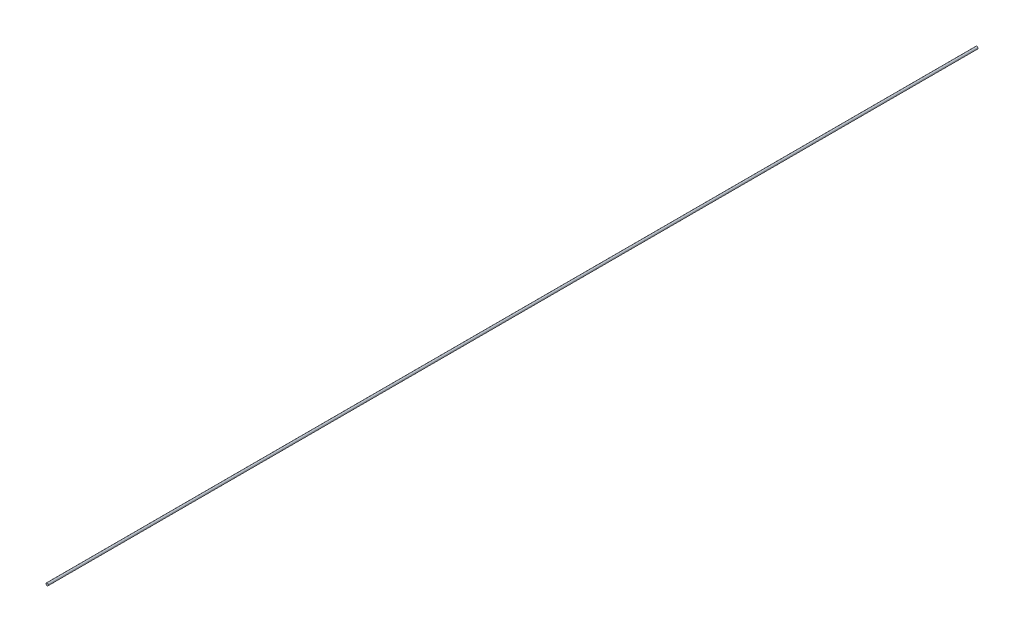
ISO-10303-21;
HEADER;
FILE_DESCRIPTION(('STEP AP214'),'2;1');
FILE_NAME('part.step','',(''),(''),'','','');
FILE_SCHEMA(('AUTOMOTIVE_DESIGN { 1 0 10303 214 1 1 1 1 }'));
ENDSEC;
DATA;
#1=APPLICATION_CONTEXT('core data for automotive mechanical design processes');
#2=APPLICATION_PROTOCOL_DEFINITION('international standard','automotive_design',2000,#1);
#3=PRODUCT_CONTEXT('',#1,'mechanical');
#4=PRODUCT('Part','Part','',(#3));
#5=PRODUCT_RELATED_PRODUCT_CATEGORY('part','',(#4));
#6=PRODUCT_DEFINITION_FORMATION('','',#4);
#7=PRODUCT_DEFINITION_CONTEXT('part definition',#1,'design');
#8=PRODUCT_DEFINITION('design','',#6,#7);
#9=PRODUCT_DEFINITION_SHAPE('','',#8);
#10=(LENGTH_UNIT() NAMED_UNIT(*) SI_UNIT(.MILLI.,.METRE.));
#11=(NAMED_UNIT(*) PLANE_ANGLE_UNIT() SI_UNIT($,.RADIAN.));
#12=(NAMED_UNIT(*) SI_UNIT($,.STERADIAN.) SOLID_ANGLE_UNIT());
#13=UNCERTAINTY_MEASURE_WITH_UNIT(LENGTH_MEASURE(1.E-05),#10,'distance_accuracy_value','');
#14=(GEOMETRIC_REPRESENTATION_CONTEXT(3) GLOBAL_UNCERTAINTY_ASSIGNED_CONTEXT((#13)) GLOBAL_UNIT_ASSIGNED_CONTEXT((#10,
#11,#12)) REPRESENTATION_CONTEXT('',''));
#15=CARTESIAN_POINT('',(0.,0.,0.));
#16=DIRECTION('',(0.,0.,1.));
#17=DIRECTION('',(1.,0.,0.));
#18=AXIS2_PLACEMENT_3D('',#15,#16,#17);
#19=CARTESIAN_POINT('',(0.,0.,800.));
#20=DIRECTION('',(0.,0.,-1.));
#21=DIRECTION('',(-1.,0.,0.));
#22=AXIS2_PLACEMENT_3D('',#19,#20,#21);
#23=CYLINDRICAL_SURFACE('',#22,1.);
#24=CARTESIAN_POINT('',(0.,0.,800.));
#25=DIRECTION('',(0.,0.,1.));
#26=DIRECTION('',(1.,0.,0.));
#27=AXIS2_PLACEMENT_3D('',#24,#25,#26);
#28=CIRCLE('',#27,1.);
#29=CARTESIAN_POINT('',(1.,0.,800.));
#30=VERTEX_POINT('',#29);
#31=EDGE_CURVE('E10',#30,#30,#28,.T.);
#32=ORIENTED_EDGE('',*,*,#31,.F.);
#33=EDGE_LOOP('',(#32));
#34=FACE_BOUND('',#33,.T.);
#35=CARTESIAN_POINT('',(0.,0.,0.));
#36=DIRECTION('',(0.,0.,1.));
#37=DIRECTION('',(1.,0.,0.));
#38=AXIS2_PLACEMENT_3D('',#35,#36,#37);
#39=CIRCLE('',#38,1.);
#40=CARTESIAN_POINT('',(1.,0.,0.));
#41=VERTEX_POINT('',#40);
#42=EDGE_CURVE('E33',#41,#41,#39,.T.);
#43=ORIENTED_EDGE('',*,*,#42,.T.);
#44=EDGE_LOOP('',(#43));
#45=FACE_BOUND('',#44,.T.);
#46=ADVANCED_FACE('F30',(#34,#45),#23,.T.);
#47=CARTESIAN_POINT('',(0.,0.,800.));
#48=DIRECTION('',(0.,0.,1.));
#49=DIRECTION('',(1.,0.,0.));
#50=AXIS2_PLACEMENT_3D('',#47,#48,#49);
#51=PLANE('',#50);
#52=ORIENTED_EDGE('',*,*,#31,.T.);
#53=EDGE_LOOP('',(#52));
#54=FACE_BOUND('',#53,.T.);
#55=ADVANCED_FACE('F45',(#54),#51,.T.);
#56=CARTESIAN_POINT('',(0.,0.,0.));
#57=DIRECTION('',(0.,0.,1.));
#58=DIRECTION('',(1.,0.,0.));
#59=AXIS2_PLACEMENT_3D('',#56,#57,#58);
#60=PLANE('',#59);
#61=ORIENTED_EDGE('',*,*,#42,.F.);
#62=EDGE_LOOP('',(#61));
#63=FACE_BOUND('',#62,.T.);
#64=ADVANCED_FACE('F43',(#63),#60,.F.);
#65=CLOSED_SHELL('',(#46,#55,#64));
#66=MANIFOLD_SOLID_BREP('B2',#65);
#67=ADVANCED_BREP_SHAPE_REPRESENTATION('',(#18,#66),#14);
#68=SHAPE_DEFINITION_REPRESENTATION(#9,#67);
ENDSEC;
END-ISO-10303-21;
